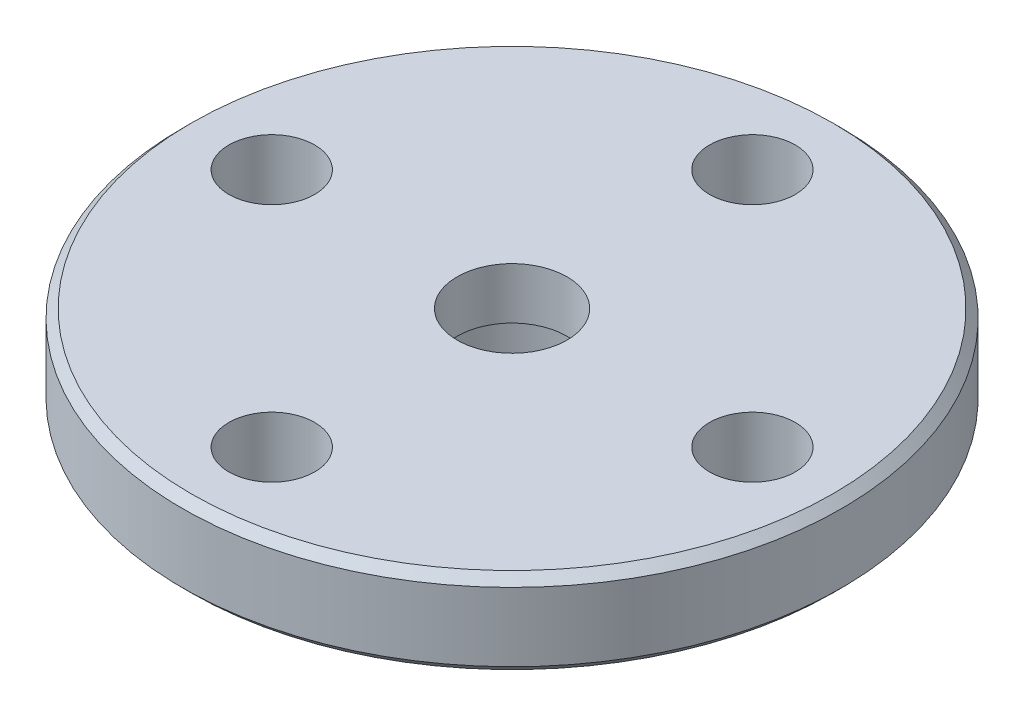
ISO-10303-21;
HEADER;
FILE_DESCRIPTION(('STEP AP214'),'2;1');
FILE_NAME('part.step','',(''),(''),'','','');
FILE_SCHEMA(('AUTOMOTIVE_DESIGN { 1 0 10303 214 1 1 1 1 }'));
ENDSEC;
DATA;
#1=APPLICATION_CONTEXT('core data for automotive mechanical design processes');
#2=APPLICATION_PROTOCOL_DEFINITION('international standard','automotive_design',2000,#1);
#3=PRODUCT_CONTEXT('',#1,'mechanical');
#4=PRODUCT('Part','Part','',(#3));
#5=PRODUCT_RELATED_PRODUCT_CATEGORY('part','',(#4));
#6=PRODUCT_DEFINITION_FORMATION('','',#4);
#7=PRODUCT_DEFINITION_CONTEXT('part definition',#1,'design');
#8=PRODUCT_DEFINITION('design','',#6,#7);
#9=PRODUCT_DEFINITION_SHAPE('','',#8);
#10=(LENGTH_UNIT() NAMED_UNIT(*) SI_UNIT(.MILLI.,.METRE.));
#11=(NAMED_UNIT(*) PLANE_ANGLE_UNIT() SI_UNIT($,.RADIAN.));
#12=(NAMED_UNIT(*) SI_UNIT($,.STERADIAN.) SOLID_ANGLE_UNIT());
#13=UNCERTAINTY_MEASURE_WITH_UNIT(LENGTH_MEASURE(1.E-05),#10,'distance_accuracy_value','');
#14=(GEOMETRIC_REPRESENTATION_CONTEXT(3) GLOBAL_UNCERTAINTY_ASSIGNED_CONTEXT((#13)) GLOBAL_UNIT_ASSIGNED_CONTEXT((#10,
#11,#12)) REPRESENTATION_CONTEXT('',''));
#15=CARTESIAN_POINT('',(0.,0.,0.));
#16=DIRECTION('',(0.,0.,1.));
#17=DIRECTION('',(1.,0.,0.));
#18=AXIS2_PLACEMENT_3D('',#15,#16,#17);
#19=CARTESIAN_POINT('',(1.6,4.5,0.));
#20=DIRECTION('',(0.,1.,0.));
#21=DIRECTION('',(0.,0.,1.));
#22=AXIS2_PLACEMENT_3D('',#19,#20,#21);
#23=PLANE('',#22);
#24=CARTESIAN_POINT('',(0.,4.5,-7.));
#25=DIRECTION('',(0.,1.,0.));
#26=DIRECTION('',(0.,0.,1.));
#27=AXIS2_PLACEMENT_3D('',#24,#25,#26);
#28=CIRCLE('',#27,1.25);
#29=CARTESIAN_POINT('',(0.,4.5,-5.75));
#30=VERTEX_POINT('',#29);
#31=EDGE_CURVE('E67',#30,#30,#28,.T.);
#32=ORIENTED_EDGE('',*,*,#31,.F.);
#33=EDGE_LOOP('',(#32));
#34=FACE_BOUND('',#33,.T.);
#35=CARTESIAN_POINT('',(0.,4.5,7.));
#36=DIRECTION('',(0.,1.,0.));
#37=DIRECTION('',(0.,0.,1.));
#38=AXIS2_PLACEMENT_3D('',#35,#36,#37);
#39=CIRCLE('',#38,1.25);
#40=CARTESIAN_POINT('',(0.,4.5,8.25));
#41=VERTEX_POINT('',#40);
#42=EDGE_CURVE('E144',#41,#41,#39,.T.);
#43=ORIENTED_EDGE('',*,*,#42,.F.);
#44=EDGE_LOOP('',(#43));
#45=FACE_BOUND('',#44,.T.);
#46=CARTESIAN_POINT('',(7.,4.5,0.));
#47=DIRECTION('',(0.,1.,0.));
#48=DIRECTION('',(0.,0.,1.));
#49=AXIS2_PLACEMENT_3D('',#46,#47,#48);
#50=CIRCLE('',#49,1.25);
#51=CARTESIAN_POINT('',(7.,4.5,1.25));
#52=VERTEX_POINT('',#51);
#53=EDGE_CURVE('E146',#52,#52,#50,.T.);
#54=ORIENTED_EDGE('',*,*,#53,.F.);
#55=EDGE_LOOP('',(#54));
#56=FACE_BOUND('',#55,.T.);
#57=CARTESIAN_POINT('',(-7.,4.5,0.));
#58=DIRECTION('',(0.,1.,0.));
#59=DIRECTION('',(0.,0.,1.));
#60=AXIS2_PLACEMENT_3D('',#57,#58,#59);
#61=CIRCLE('',#60,1.25);
#62=CARTESIAN_POINT('',(-7.,4.5,1.25));
#63=VERTEX_POINT('',#62);
#64=EDGE_CURVE('E89',#63,#63,#61,.T.);
#65=ORIENTED_EDGE('',*,*,#64,.F.);
#66=EDGE_LOOP('',(#65));
#67=FACE_BOUND('',#66,.T.);
#68=CARTESIAN_POINT('',(0.,4.5,0.));
#69=DIRECTION('',(0.,-1.,0.));
#70=DIRECTION('',(0.,0.,-1.));
#71=AXIS2_PLACEMENT_3D('',#68,#69,#70);
#72=CIRCLE('',#71,1.6);
#73=CARTESIAN_POINT('',(0.,4.5,-1.6));
#74=VERTEX_POINT('',#73);
#75=EDGE_CURVE('E78',#74,#74,#72,.T.);
#76=ORIENTED_EDGE('',*,*,#75,.T.);
#77=EDGE_LOOP('',(#76));
#78=FACE_BOUND('',#77,.T.);
#79=CARTESIAN_POINT('',(0.,4.5,0.));
#80=DIRECTION('',(0.,-1.,0.));
#81=DIRECTION('',(0.,0.,-1.));
#82=AXIS2_PLACEMENT_3D('',#79,#80,#81);
#83=CIRCLE('',#82,9.35);
#84=CARTESIAN_POINT('',(0.,4.5,-9.35));
#85=VERTEX_POINT('',#84);
#86=EDGE_CURVE('E10',#85,#85,#83,.T.);
#87=ORIENTED_EDGE('',*,*,#86,.F.);
#88=EDGE_LOOP('',(#87));
#89=FACE_BOUND('',#88,.T.);
#90=ADVANCED_FACE('F43',(#34,#45,#56,#67,#78,#89),#23,.T.);
#91=CARTESIAN_POINT('',(0.,4.25,0.));
#92=DIRECTION('',(0.,-1.,0.));
#93=DIRECTION('',(0.,0.,-1.));
#94=AXIS2_PLACEMENT_3D('',#91,#92,#93);
#95=CONICAL_SURFACE('',#94,9.6,0.78539816339745);
#96=ORIENTED_EDGE('',*,*,#86,.T.);
#97=EDGE_LOOP('',(#96));
#98=FACE_BOUND('',#97,.T.);
#99=CARTESIAN_POINT('',(0.,4.25,0.));
#100=DIRECTION('',(0.,-1.,0.));
#101=DIRECTION('',(0.,0.,-1.));
#102=AXIS2_PLACEMENT_3D('',#99,#100,#101);
#103=CIRCLE('',#102,9.6);
#104=CARTESIAN_POINT('',(0.,4.25,-9.6));
#105=VERTEX_POINT('',#104);
#106=EDGE_CURVE('E51',#105,#105,#103,.T.);
#107=ORIENTED_EDGE('',*,*,#106,.F.);
#108=EDGE_LOOP('',(#107));
#109=FACE_BOUND('',#108,.T.);
#110=ADVANCED_FACE('F125',(#98,#109),#95,.T.);
#111=CARTESIAN_POINT('',(0.,0.,0.));
#112=DIRECTION('',(0.,-1.,0.));
#113=DIRECTION('',(0.,0.,-1.));
#114=AXIS2_PLACEMENT_3D('',#111,#112,#113);
#115=CYLINDRICAL_SURFACE('',#114,9.6);
#116=ORIENTED_EDGE('',*,*,#106,.T.);
#117=EDGE_LOOP('',(#116));
#118=FACE_BOUND('',#117,.T.);
#119=CARTESIAN_POINT('',(0.,2.25,0.));
#120=DIRECTION('',(0.,-1.,0.));
#121=DIRECTION('',(0.,0.,-1.));
#122=AXIS2_PLACEMENT_3D('',#119,#120,#121);
#123=CIRCLE('',#122,9.6);
#124=CARTESIAN_POINT('',(0.,2.25,-9.6));
#125=VERTEX_POINT('',#124);
#126=EDGE_CURVE('E60',#125,#125,#123,.T.);
#127=ORIENTED_EDGE('',*,*,#126,.F.);
#128=EDGE_LOOP('',(#127));
#129=FACE_BOUND('',#128,.T.);
#130=ADVANCED_FACE('F122',(#118,#129),#115,.T.);
#131=CARTESIAN_POINT('',(0.,2.,0.));
#132=DIRECTION('',(0.,1.,0.));
#133=DIRECTION('',(0.,0.,1.));
#134=AXIS2_PLACEMENT_3D('',#131,#132,#133);
#135=CONICAL_SURFACE('',#134,9.35,0.78539816339745);
#136=ORIENTED_EDGE('',*,*,#126,.T.);
#137=EDGE_LOOP('',(#136));
#138=FACE_BOUND('',#137,.T.);
#139=CARTESIAN_POINT('',(0.,2.,0.));
#140=DIRECTION('',(0.,-1.,0.));
#141=DIRECTION('',(0.,0.,-1.));
#142=AXIS2_PLACEMENT_3D('',#139,#140,#141);
#143=CIRCLE('',#142,9.35);
#144=CARTESIAN_POINT('',(0.,2.,-9.35));
#145=VERTEX_POINT('',#144);
#146=EDGE_CURVE('E115',#145,#145,#143,.T.);
#147=ORIENTED_EDGE('',*,*,#146,.F.);
#148=EDGE_LOOP('',(#147));
#149=FACE_BOUND('',#148,.T.);
#150=ADVANCED_FACE('F117',(#138,#149),#135,.T.);
#151=CARTESIAN_POINT('',(9.35,2.,0.));
#152=DIRECTION('',(0.,-1.,0.));
#153=DIRECTION('',(0.,0.,-1.));
#154=AXIS2_PLACEMENT_3D('',#151,#152,#153);
#155=PLANE('',#154);
#156=CARTESIAN_POINT('',(0.,2.,-7.));
#157=DIRECTION('',(0.,-1.,0.));
#158=DIRECTION('',(0.,0.,-1.));
#159=AXIS2_PLACEMENT_3D('',#156,#157,#158);
#160=CIRCLE('',#159,1.25);
#161=CARTESIAN_POINT('',(0.,2.,-8.25));
#162=VERTEX_POINT('',#161);
#163=EDGE_CURVE('E46',#162,#162,#160,.F.);
#164=ORIENTED_EDGE('',*,*,#163,.T.);
#165=EDGE_LOOP('',(#164));
#166=FACE_BOUND('',#165,.T.);
#167=CARTESIAN_POINT('',(0.,2.,7.));
#168=DIRECTION('',(0.,-1.,0.));
#169=DIRECTION('',(0.,0.,-1.));
#170=AXIS2_PLACEMENT_3D('',#167,#168,#169);
#171=CIRCLE('',#170,1.25);
#172=CARTESIAN_POINT('',(0.,2.,5.75));
#173=VERTEX_POINT('',#172);
#174=EDGE_CURVE('E69',#173,#173,#171,.F.);
#175=ORIENTED_EDGE('',*,*,#174,.T.);
#176=EDGE_LOOP('',(#175));
#177=FACE_BOUND('',#176,.T.);
#178=CARTESIAN_POINT('',(7.,2.,0.));
#179=DIRECTION('',(0.,-1.,0.));
#180=DIRECTION('',(0.,0.,-1.));
#181=AXIS2_PLACEMENT_3D('',#178,#179,#180);
#182=CIRCLE('',#181,1.25);
#183=CARTESIAN_POINT('',(7.,2.,-1.25));
#184=VERTEX_POINT('',#183);
#185=EDGE_CURVE('E64',#184,#184,#182,.F.);
#186=ORIENTED_EDGE('',*,*,#185,.T.);
#187=EDGE_LOOP('',(#186));
#188=FACE_BOUND('',#187,.T.);
#189=CARTESIAN_POINT('',(-7.,2.,0.));
#190=DIRECTION('',(0.,-1.,0.));
#191=DIRECTION('',(0.,0.,-1.));
#192=AXIS2_PLACEMENT_3D('',#189,#190,#191);
#193=CIRCLE('',#192,1.25);
#194=CARTESIAN_POINT('',(-7.,2.,-1.25));
#195=VERTEX_POINT('',#194);
#196=EDGE_CURVE('E63',#195,#195,#193,.F.);
#197=ORIENTED_EDGE('',*,*,#196,.T.);
#198=EDGE_LOOP('',(#197));
#199=FACE_BOUND('',#198,.T.);
#200=ORIENTED_EDGE('',*,*,#146,.T.);
#201=EDGE_LOOP('',(#200));
#202=FACE_BOUND('',#201,.T.);
#203=CARTESIAN_POINT('',(0.,2.,0.));
#204=DIRECTION('',(0.,-1.,0.));
#205=DIRECTION('',(0.,0.,-1.));
#206=AXIS2_PLACEMENT_3D('',#203,#204,#205);
#207=CIRCLE('',#206,5.3);
#208=CARTESIAN_POINT('',(0.,2.,-5.3));
#209=VERTEX_POINT('',#208);
#210=EDGE_CURVE('E106',#209,#209,#207,.T.);
#211=ORIENTED_EDGE('',*,*,#210,.F.);
#212=EDGE_LOOP('',(#211));
#213=FACE_BOUND('',#212,.T.);
#214=ADVANCED_FACE('F131',(#166,#177,#188,#199,#202,#213),#155,.T.);
#215=CARTESIAN_POINT('',(0.,0.,0.));
#216=DIRECTION('',(0.,-1.,0.));
#217=DIRECTION('',(0.,0.,-1.));
#218=AXIS2_PLACEMENT_3D('',#215,#216,#217);
#219=CYLINDRICAL_SURFACE('',#218,5.3);
#220=ORIENTED_EDGE('',*,*,#210,.T.);
#221=EDGE_LOOP('',(#220));
#222=FACE_BOUND('',#221,.T.);
#223=CARTESIAN_POINT('',(0.,0.25,0.));
#224=DIRECTION('',(0.,-1.,0.));
#225=DIRECTION('',(0.,0.,-1.));
#226=AXIS2_PLACEMENT_3D('',#223,#224,#225);
#227=CIRCLE('',#226,5.3);
#228=CARTESIAN_POINT('',(0.,0.25,-5.3));
#229=VERTEX_POINT('',#228);
#230=EDGE_CURVE('E101',#229,#229,#227,.T.);
#231=ORIENTED_EDGE('',*,*,#230,.F.);
#232=EDGE_LOOP('',(#231));
#233=FACE_BOUND('',#232,.T.);
#234=ADVANCED_FACE('F197',(#222,#233),#219,.T.);
#235=CARTESIAN_POINT('',(0.,0.,0.));
#236=DIRECTION('',(0.,1.,0.));
#237=DIRECTION('',(0.,0.,1.));
#238=AXIS2_PLACEMENT_3D('',#235,#236,#237);
#239=CONICAL_SURFACE('',#238,5.05,0.785398163397448);
#240=ORIENTED_EDGE('',*,*,#230,.T.);
#241=EDGE_LOOP('',(#240));
#242=FACE_BOUND('',#241,.T.);
#243=CARTESIAN_POINT('',(0.,0.,0.));
#244=DIRECTION('',(0.,-1.,0.));
#245=DIRECTION('',(0.,0.,-1.));
#246=AXIS2_PLACEMENT_3D('',#243,#244,#245);
#247=CIRCLE('',#246,5.05);
#248=CARTESIAN_POINT('',(0.,0.,-5.05));
#249=VERTEX_POINT('',#248);
#250=EDGE_CURVE('E99',#249,#249,#247,.T.);
#251=ORIENTED_EDGE('',*,*,#250,.F.);
#252=EDGE_LOOP('',(#251));
#253=FACE_BOUND('',#252,.T.);
#254=ADVANCED_FACE('F193',(#242,#253),#239,.T.);
#255=CARTESIAN_POINT('',(5.05,0.,0.));
#256=DIRECTION('',(0.,-1.,0.));
#257=DIRECTION('',(0.,0.,-1.));
#258=AXIS2_PLACEMENT_3D('',#255,#256,#257);
#259=PLANE('',#258);
#260=ORIENTED_EDGE('',*,*,#250,.T.);
#261=EDGE_LOOP('',(#260));
#262=FACE_BOUND('',#261,.T.);
#263=CARTESIAN_POINT('',(0.,0.,0.));
#264=DIRECTION('',(0.,-1.,0.));
#265=DIRECTION('',(0.,0.,-1.));
#266=AXIS2_PLACEMENT_3D('',#263,#264,#265);
#267=CIRCLE('',#266,2.6);
#268=CARTESIAN_POINT('',(0.,0.,-2.6));
#269=VERTEX_POINT('',#268);
#270=EDGE_CURVE('E96',#269,#269,#267,.T.);
#271=ORIENTED_EDGE('',*,*,#270,.F.);
#272=EDGE_LOOP('',(#271));
#273=FACE_BOUND('',#272,.T.);
#274=ADVANCED_FACE('F192',(#262,#273),#259,.T.);
#275=CARTESIAN_POINT('',(0.,0.,0.));
#276=DIRECTION('',(0.,-1.,0.));
#277=DIRECTION('',(0.,0.,-1.));
#278=AXIS2_PLACEMENT_3D('',#275,#276,#277);
#279=CYLINDRICAL_SURFACE('',#278,2.6);
#280=ORIENTED_EDGE('',*,*,#270,.T.);
#281=EDGE_LOOP('',(#280));
#282=FACE_BOUND('',#281,.T.);
#283=CARTESIAN_POINT('',(0.,3.,0.));
#284=DIRECTION('',(0.,-1.,0.));
#285=DIRECTION('',(0.,0.,-1.));
#286=AXIS2_PLACEMENT_3D('',#283,#284,#285);
#287=CIRCLE('',#286,2.6);
#288=CARTESIAN_POINT('',(0.,3.,-2.6));
#289=VERTEX_POINT('',#288);
#290=EDGE_CURVE('E90',#289,#289,#287,.T.);
#291=ORIENTED_EDGE('',*,*,#290,.F.);
#292=EDGE_LOOP('',(#291));
#293=FACE_BOUND('',#292,.T.);
#294=ADVANCED_FACE('F190',(#282,#293),#279,.F.);
#295=CARTESIAN_POINT('',(1.6,3.,0.));
#296=DIRECTION('',(0.,-1.,0.));
#297=DIRECTION('',(0.,0.,-1.));
#298=AXIS2_PLACEMENT_3D('',#295,#296,#297);
#299=PLANE('',#298);
#300=ORIENTED_EDGE('',*,*,#290,.T.);
#301=EDGE_LOOP('',(#300));
#302=FACE_BOUND('',#301,.T.);
#303=CARTESIAN_POINT('',(0.,3.,0.));
#304=DIRECTION('',(0.,-1.,0.));
#305=DIRECTION('',(0.,0.,-1.));
#306=AXIS2_PLACEMENT_3D('',#303,#304,#305);
#307=CIRCLE('',#306,1.6);
#308=CARTESIAN_POINT('',(0.,3.,-1.6));
#309=VERTEX_POINT('',#308);
#310=EDGE_CURVE('E83',#309,#309,#307,.T.);
#311=ORIENTED_EDGE('',*,*,#310,.F.);
#312=EDGE_LOOP('',(#311));
#313=FACE_BOUND('',#312,.T.);
#314=ADVANCED_FACE('F183',(#302,#313),#299,.T.);
#315=CARTESIAN_POINT('',(0.,0.,0.));
#316=DIRECTION('',(0.,-1.,0.));
#317=DIRECTION('',(0.,0.,-1.));
#318=AXIS2_PLACEMENT_3D('',#315,#316,#317);
#319=CYLINDRICAL_SURFACE('',#318,1.6);
#320=ORIENTED_EDGE('',*,*,#310,.T.);
#321=EDGE_LOOP('',(#320));
#322=FACE_BOUND('',#321,.T.);
#323=ORIENTED_EDGE('',*,*,#75,.F.);
#324=EDGE_LOOP('',(#323));
#325=FACE_BOUND('',#324,.T.);
#326=ADVANCED_FACE('F179',(#322,#325),#319,.F.);
#327=CARTESIAN_POINT('',(-7.,4.5,0.));
#328=DIRECTION('',(0.,-1.,0.));
#329=DIRECTION('',(0.,0.,-1.));
#330=AXIS2_PLACEMENT_3D('',#327,#328,#329);
#331=CYLINDRICAL_SURFACE('',#330,1.25);
#332=ORIENTED_EDGE('',*,*,#196,.F.);
#333=EDGE_LOOP('',(#332));
#334=FACE_BOUND('',#333,.T.);
#335=ORIENTED_EDGE('',*,*,#64,.T.);
#336=EDGE_LOOP('',(#335));
#337=FACE_BOUND('',#336,.T.);
#338=ADVANCED_FACE('F176',(#334,#337),#331,.F.);
#339=CARTESIAN_POINT('',(7.,4.5,0.));
#340=DIRECTION('',(0.,-1.,0.));
#341=DIRECTION('',(0.,0.,-1.));
#342=AXIS2_PLACEMENT_3D('',#339,#340,#341);
#343=CYLINDRICAL_SURFACE('',#342,1.25);
#344=ORIENTED_EDGE('',*,*,#185,.F.);
#345=EDGE_LOOP('',(#344));
#346=FACE_BOUND('',#345,.T.);
#347=ORIENTED_EDGE('',*,*,#53,.T.);
#348=EDGE_LOOP('',(#347));
#349=FACE_BOUND('',#348,.T.);
#350=ADVANCED_FACE('F169',(#346,#349),#343,.F.);
#351=CARTESIAN_POINT('',(0.,4.5,7.));
#352=DIRECTION('',(0.,-1.,0.));
#353=DIRECTION('',(0.,0.,-1.));
#354=AXIS2_PLACEMENT_3D('',#351,#352,#353);
#355=CYLINDRICAL_SURFACE('',#354,1.25);
#356=ORIENTED_EDGE('',*,*,#174,.F.);
#357=EDGE_LOOP('',(#356));
#358=FACE_BOUND('',#357,.T.);
#359=ORIENTED_EDGE('',*,*,#42,.T.);
#360=EDGE_LOOP('',(#359));
#361=FACE_BOUND('',#360,.T.);
#362=ADVANCED_FACE('F162',(#358,#361),#355,.F.);
#363=CARTESIAN_POINT('',(0.,4.5,-7.));
#364=DIRECTION('',(0.,-1.,0.));
#365=DIRECTION('',(0.,0.,-1.));
#366=AXIS2_PLACEMENT_3D('',#363,#364,#365);
#367=CYLINDRICAL_SURFACE('',#366,1.25);
#368=ORIENTED_EDGE('',*,*,#163,.F.);
#369=EDGE_LOOP('',(#368));
#370=FACE_BOUND('',#369,.T.);
#371=ORIENTED_EDGE('',*,*,#31,.T.);
#372=EDGE_LOOP('',(#371));
#373=FACE_BOUND('',#372,.T.);
#374=ADVANCED_FACE('F165',(#370,#373),#367,.F.);
#375=CLOSED_SHELL('',(#90,#110,#130,#150,#214,#234,#254,#274,#294,#314,#326,#338,#350,#362,#374));
#376=MANIFOLD_SOLID_BREP('B2',#375);
#377=ADVANCED_BREP_SHAPE_REPRESENTATION('',(#18,#376),#14);
#378=SHAPE_DEFINITION_REPRESENTATION(#9,#377);
ENDSEC;
END-ISO-10303-21;
